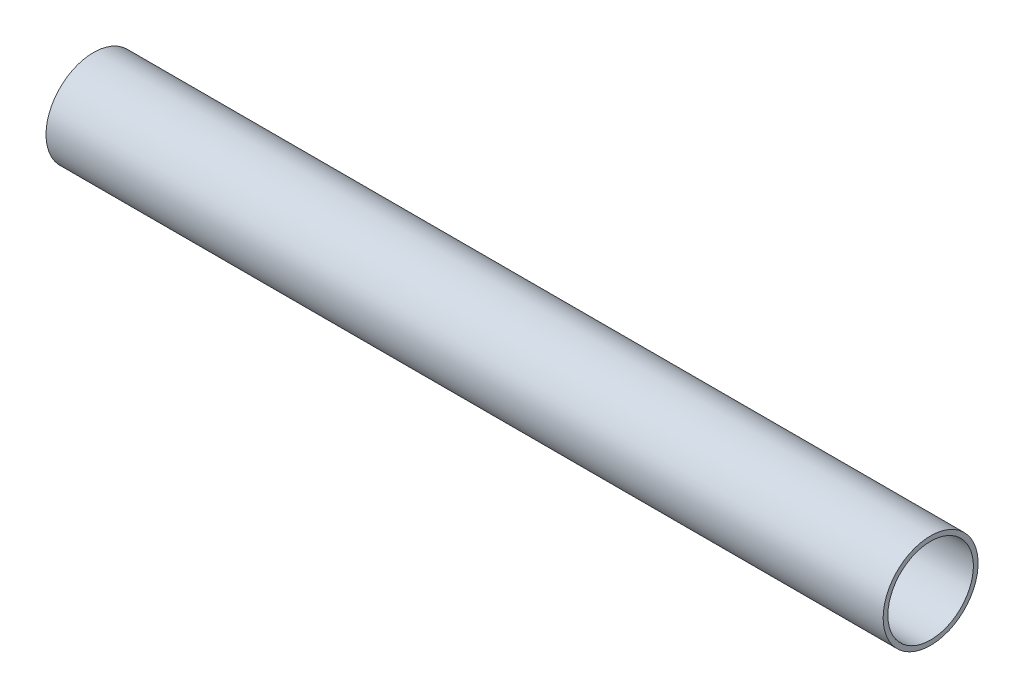
ISO-10303-21;
HEADER;
FILE_DESCRIPTION(('STEP AP214'),'2;1');
FILE_NAME('part.step','',(''),(''),'','','');
FILE_SCHEMA(('AUTOMOTIVE_DESIGN { 1 0 10303 214 1 1 1 1 }'));
ENDSEC;
DATA;
#1=APPLICATION_CONTEXT('core data for automotive mechanical design processes');
#2=APPLICATION_PROTOCOL_DEFINITION('international standard','automotive_design',2000,#1);
#3=PRODUCT_CONTEXT('',#1,'mechanical');
#4=PRODUCT('Part','Part','',(#3));
#5=PRODUCT_RELATED_PRODUCT_CATEGORY('part','',(#4));
#6=PRODUCT_DEFINITION_FORMATION('','',#4);
#7=PRODUCT_DEFINITION_CONTEXT('part definition',#1,'design');
#8=PRODUCT_DEFINITION('design','',#6,#7);
#9=PRODUCT_DEFINITION_SHAPE('','',#8);
#10=(LENGTH_UNIT() NAMED_UNIT(*) SI_UNIT(.MILLI.,.METRE.));
#11=(NAMED_UNIT(*) PLANE_ANGLE_UNIT() SI_UNIT($,.RADIAN.));
#12=(NAMED_UNIT(*) SI_UNIT($,.STERADIAN.) SOLID_ANGLE_UNIT());
#13=UNCERTAINTY_MEASURE_WITH_UNIT(LENGTH_MEASURE(1.E-05),#10,'distance_accuracy_value','');
#14=(GEOMETRIC_REPRESENTATION_CONTEXT(3) GLOBAL_UNCERTAINTY_ASSIGNED_CONTEXT((#13)) GLOBAL_UNIT_ASSIGNED_CONTEXT((#10,
#11,#12)) REPRESENTATION_CONTEXT('',''));
#15=CARTESIAN_POINT('',(0.,0.,0.));
#16=DIRECTION('',(0.,0.,1.));
#17=DIRECTION('',(1.,0.,0.));
#18=AXIS2_PLACEMENT_3D('',#15,#16,#17);
#19=CARTESIAN_POINT('',(139.95575006,0.,0.));
#20=DIRECTION('',(1.,0.,0.));
#21=DIRECTION('',(0.,0.,-1.));
#22=AXIS2_PLACEMENT_3D('',#19,#20,#21);
#23=PLANE('',#22);
#24=CARTESIAN_POINT('',(139.95575006,0.,0.));
#25=DIRECTION('',(1.,0.,0.));
#26=DIRECTION('',(0.,0.,-1.));
#27=AXIS2_PLACEMENT_3D('',#24,#25,#26);
#28=CIRCLE('',#27,15.875);
#29=CARTESIAN_POINT('',(139.95575006,0.,15.875));
#30=VERTEX_POINT('',#29);
#31=EDGE_CURVE('E11',#30,#30,#28,.T.);
#32=ORIENTED_EDGE('',*,*,#31,.T.);
#33=EDGE_LOOP('',(#32));
#34=FACE_BOUND('',#33,.T.);
#35=CARTESIAN_POINT('',(139.95575006,0.,0.));
#36=DIRECTION('',(1.,0.,0.));
#37=DIRECTION('',(0.,0.,-1.));
#38=AXIS2_PLACEMENT_3D('',#35,#36,#37);
#39=CIRCLE('',#38,14.2875);
#40=CARTESIAN_POINT('',(139.95575006,0.,14.2875));
#41=VERTEX_POINT('',#40);
#42=EDGE_CURVE('E58',#41,#41,#39,.T.);
#43=ORIENTED_EDGE('',*,*,#42,.F.);
#44=EDGE_LOOP('',(#43));
#45=FACE_BOUND('',#44,.T.);
#46=ADVANCED_FACE('F47',(#34,#45),#23,.T.);
#47=CARTESIAN_POINT('',(-139.95575006,0.,0.));
#48=DIRECTION('',(1.,0.,0.));
#49=DIRECTION('',(0.,0.,-1.));
#50=AXIS2_PLACEMENT_3D('',#47,#48,#49);
#51=PLANE('',#50);
#52=CARTESIAN_POINT('',(-139.95575006,0.,0.));
#53=DIRECTION('',(1.,0.,0.));
#54=DIRECTION('',(0.,0.,-1.));
#55=AXIS2_PLACEMENT_3D('',#52,#53,#54);
#56=CIRCLE('',#55,15.875);
#57=CARTESIAN_POINT('',(-139.95575006,0.,15.875));
#58=VERTEX_POINT('',#57);
#59=EDGE_CURVE('E51',#58,#58,#56,.T.);
#60=ORIENTED_EDGE('',*,*,#59,.F.);
#61=EDGE_LOOP('',(#60));
#62=FACE_BOUND('',#61,.T.);
#63=CARTESIAN_POINT('',(-139.95575006,0.,0.));
#64=DIRECTION('',(1.,0.,0.));
#65=DIRECTION('',(0.,0.,-1.));
#66=AXIS2_PLACEMENT_3D('',#63,#64,#65);
#67=CIRCLE('',#66,14.2875);
#68=CARTESIAN_POINT('',(-139.95575006,0.,14.2875));
#69=VERTEX_POINT('',#68);
#70=EDGE_CURVE('E60',#69,#69,#67,.T.);
#71=ORIENTED_EDGE('',*,*,#70,.T.);
#72=EDGE_LOOP('',(#71));
#73=FACE_BOUND('',#72,.T.);
#74=ADVANCED_FACE('F70',(#62,#73),#51,.F.);
#75=CARTESIAN_POINT('',(139.95575006,0.,0.));
#76=DIRECTION('',(-1.,0.,0.));
#77=DIRECTION('',(0.,0.,1.));
#78=AXIS2_PLACEMENT_3D('',#75,#76,#77);
#79=CYLINDRICAL_SURFACE('',#78,15.875);
#80=CARTESIAN_POINT('',(139.95575006,0.,15.875));
#81=CARTESIAN_POINT('',(137.040005267083,0.,15.875));
#82=CARTESIAN_POINT('',(134.124260474167,0.,15.875));
#83=CARTESIAN_POINT('',(128.292770888333,0.,15.875));
#84=CARTESIAN_POINT('',(125.377026095417,0.,15.875));
#85=CARTESIAN_POINT('',(119.545536509583,0.,15.875));
#86=CARTESIAN_POINT('',(116.629791716667,0.,15.875));
#87=CARTESIAN_POINT('',(110.798302130833,0.,15.875));
#88=CARTESIAN_POINT('',(107.882557337917,0.,15.875));
#89=CARTESIAN_POINT('',(102.051067752083,0.,15.875));
#90=CARTESIAN_POINT('',(99.1353229591666,0.,15.875));
#91=CARTESIAN_POINT('',(93.3038333733333,0.,15.875));
#92=CARTESIAN_POINT('',(90.3880885804166,0.,15.875));
#93=CARTESIAN_POINT('',(84.5565989945833,0.,15.875));
#94=CARTESIAN_POINT('',(81.6408542016666,0.,15.875));
#95=CARTESIAN_POINT('',(75.8093646158333,0.,15.875));
#96=CARTESIAN_POINT('',(72.8936198229166,0.,15.875));
#97=CARTESIAN_POINT('',(67.0621302370833,0.,15.875));
#98=CARTESIAN_POINT('',(64.1463854441666,0.,15.875));
#99=CARTESIAN_POINT('',(58.3148958583333,0.,15.875));
#100=CARTESIAN_POINT('',(55.3991510654166,0.,15.875));
#101=CARTESIAN_POINT('',(49.5676614795833,0.,15.875));
#102=CARTESIAN_POINT('',(46.6519166866666,0.,15.875));
#103=CARTESIAN_POINT('',(40.8204271008333,0.,15.875));
#104=CARTESIAN_POINT('',(37.9046823079166,0.,15.875));
#105=CARTESIAN_POINT('',(32.0731927220833,0.,15.875));
#106=CARTESIAN_POINT('',(29.1574479291666,0.,15.875));
#107=CARTESIAN_POINT('',(23.3259583433333,0.,15.875));
#108=CARTESIAN_POINT('',(20.4102135504166,0.,15.875));
#109=CARTESIAN_POINT('',(14.5787239645833,0.,15.875));
#110=CARTESIAN_POINT('',(11.6629791716666,0.,15.875));
#111=CARTESIAN_POINT('',(5.83148958583327,0.,15.875));
#112=CARTESIAN_POINT('',(2.91574479291661,0.,15.875));
#113=CARTESIAN_POINT('',(-2.91574479291672,0.,15.875));
#114=CARTESIAN_POINT('',(-5.83148958583339,0.,15.875));
#115=CARTESIAN_POINT('',(-11.6629791716667,0.,15.875));
#116=CARTESIAN_POINT('',(-14.5787239645834,0.,15.875));
#117=CARTESIAN_POINT('',(-20.4102135504167,0.,15.875));
#118=CARTESIAN_POINT('',(-23.3259583433334,0.,15.875));
#119=CARTESIAN_POINT('',(-29.1574479291667,0.,15.875));
#120=CARTESIAN_POINT('',(-32.0731927220834,0.,15.875));
#121=CARTESIAN_POINT('',(-37.9046823079167,0.,15.875));
#122=CARTESIAN_POINT('',(-40.8204271008334,0.,15.875));
#123=CARTESIAN_POINT('',(-46.6519166866667,0.,15.875));
#124=CARTESIAN_POINT('',(-49.5676614795834,0.,15.875));
#125=CARTESIAN_POINT('',(-55.3991510654168,0.,15.875));
#126=CARTESIAN_POINT('',(-58.3148958583334,0.,15.875));
#127=CARTESIAN_POINT('',(-64.1463854441667,0.,15.875));
#128=CARTESIAN_POINT('',(-67.0621302370834,0.,15.875));
#129=CARTESIAN_POINT('',(-72.8936198229167,0.,15.875));
#130=CARTESIAN_POINT('',(-75.8093646158334,0.,15.875));
#131=CARTESIAN_POINT('',(-81.6408542016667,0.,15.875));
#132=CARTESIAN_POINT('',(-84.5565989945834,0.,15.875));
#133=CARTESIAN_POINT('',(-90.3880885804167,0.,15.875));
#134=CARTESIAN_POINT('',(-93.3038333733334,0.,15.875));
#135=CARTESIAN_POINT('',(-99.1353229591668,0.,15.875));
#136=CARTESIAN_POINT('',(-102.051067752083,0.,15.875));
#137=CARTESIAN_POINT('',(-107.882557337917,0.,15.875));
#138=CARTESIAN_POINT('',(-110.798302130833,0.,15.875));
#139=CARTESIAN_POINT('',(-116.629791716667,0.,15.875));
#140=CARTESIAN_POINT('',(-119.545536509583,0.,15.875));
#141=CARTESIAN_POINT('',(-125.377026095417,0.,15.875));
#142=CARTESIAN_POINT('',(-128.292770888333,0.,15.875));
#143=CARTESIAN_POINT('',(-134.124260474167,0.,15.875));
#144=CARTESIAN_POINT('',(-137.040005267083,0.,15.875));
#145=CARTESIAN_POINT('',(-139.95575006,0.,15.875));
#146=B_SPLINE_CURVE_WITH_KNOTS('',3,(#80,#81,#82,#83,#84,#85,#86,#87,#88,#89,#90,#91,#92,#93,
#94,#95,#96,#97,#98,#99,#100,#101,#102,#103,#104,#105,#106,#107,#108,#109,#110,#111,#112,#113,
#114,#115,#116,#117,#118,#119,#120,#121,#122,#123,#124,#125,#126,#127,#128,#129,#130,#131,#132,
#133,#134,#135,#136,#137,#138,#139,#140,#141,#142,#143,#144,#145),.UNSPECIFIED.,.F.,.F.,(4,2,2,
2,2,2,2,2,2,2,2,2,2,2,2,2,2,2,2,2,2,2,2,2,2,2,2,2,2,2,2,2,4),(0.,8.74723437875,17.4944687575,
26.24170313625,34.988937515,43.73617189375,52.4834062725,61.23064065125,69.97787503,
78.72510940875,87.4723437875,96.21957816625,104.966812545,113.71404692375,122.4612813025,
131.20851568125,139.95575006,148.70298443875,157.4502188175,166.19745319625,174.944687575,
183.69192195375,192.4391563325,201.18639071125,209.93362509,218.68085946875,227.4280938475,
236.17532822625,244.922562605,253.66979698375,262.4170313625,271.16426574125,279.91150012),.UNSPECIFIED.);
#147=EDGE_CURVE('BSEAM49',#30,#58,#146,.T.);
#148=ORIENTED_EDGE('',*,*,#31,.F.);
#149=ORIENTED_EDGE('',*,*,#59,.T.);
#150=ORIENTED_EDGE('',*,*,#147,.T.);
#151=ORIENTED_EDGE('',*,*,#147,.F.);
#152=EDGE_LOOP('',(#148,#150,#149,#151));
#153=FACE_BOUND('',#152,.T.);
#154=ADVANCED_FACE('F49',(#153),#79,.T.);
#155=CARTESIAN_POINT('',(139.95575006,0.,0.));
#156=DIRECTION('',(-1.,0.,0.));
#157=DIRECTION('',(0.,0.,1.));
#158=AXIS2_PLACEMENT_3D('',#155,#156,#157);
#159=CYLINDRICAL_SURFACE('',#158,14.2875);
#160=CARTESIAN_POINT('',(139.95575006,0.,14.2875));
#161=CARTESIAN_POINT('',(137.040005267083,0.,14.2875));
#162=CARTESIAN_POINT('',(134.124260474167,0.,14.2875));
#163=CARTESIAN_POINT('',(128.292770888333,0.,14.2875));
#164=CARTESIAN_POINT('',(125.377026095417,0.,14.2875));
#165=CARTESIAN_POINT('',(119.545536509583,0.,14.2875));
#166=CARTESIAN_POINT('',(116.629791716667,0.,14.2875));
#167=CARTESIAN_POINT('',(110.798302130833,0.,14.2875));
#168=CARTESIAN_POINT('',(107.882557337917,0.,14.2875));
#169=CARTESIAN_POINT('',(102.051067752083,0.,14.2875));
#170=CARTESIAN_POINT('',(99.1353229591666,0.,14.2875));
#171=CARTESIAN_POINT('',(93.3038333733333,0.,14.2875));
#172=CARTESIAN_POINT('',(90.3880885804166,0.,14.2875));
#173=CARTESIAN_POINT('',(84.5565989945833,0.,14.2875));
#174=CARTESIAN_POINT('',(81.6408542016666,0.,14.2875));
#175=CARTESIAN_POINT('',(75.8093646158333,0.,14.2875));
#176=CARTESIAN_POINT('',(72.8936198229166,0.,14.2875));
#177=CARTESIAN_POINT('',(67.0621302370833,0.,14.2875));
#178=CARTESIAN_POINT('',(64.1463854441666,0.,14.2875));
#179=CARTESIAN_POINT('',(58.3148958583333,0.,14.2875));
#180=CARTESIAN_POINT('',(55.3991510654166,0.,14.2875));
#181=CARTESIAN_POINT('',(49.5676614795833,0.,14.2875));
#182=CARTESIAN_POINT('',(46.6519166866666,0.,14.2875));
#183=CARTESIAN_POINT('',(40.8204271008333,0.,14.2875));
#184=CARTESIAN_POINT('',(37.9046823079166,0.,14.2875));
#185=CARTESIAN_POINT('',(32.0731927220833,0.,14.2875));
#186=CARTESIAN_POINT('',(29.1574479291666,0.,14.2875));
#187=CARTESIAN_POINT('',(23.3259583433333,0.,14.2875));
#188=CARTESIAN_POINT('',(20.4102135504166,0.,14.2875));
#189=CARTESIAN_POINT('',(14.5787239645833,0.,14.2875));
#190=CARTESIAN_POINT('',(11.6629791716666,0.,14.2875));
#191=CARTESIAN_POINT('',(5.8314895858333,0.,14.2875));
#192=CARTESIAN_POINT('',(2.91574479291664,0.,14.2875));
#193=CARTESIAN_POINT('',(-2.91574479291669,0.,14.2875));
#194=CARTESIAN_POINT('',(-5.83148958583336,0.,14.2875));
#195=CARTESIAN_POINT('',(-11.6629791716667,0.,14.2875));
#196=CARTESIAN_POINT('',(-14.5787239645834,0.,14.2875));
#197=CARTESIAN_POINT('',(-20.4102135504167,0.,14.2875));
#198=CARTESIAN_POINT('',(-23.3259583433334,0.,14.2875));
#199=CARTESIAN_POINT('',(-29.1574479291667,0.,14.2875));
#200=CARTESIAN_POINT('',(-32.0731927220834,0.,14.2875));
#201=CARTESIAN_POINT('',(-37.9046823079167,0.,14.2875));
#202=CARTESIAN_POINT('',(-40.8204271008334,0.,14.2875));
#203=CARTESIAN_POINT('',(-46.6519166866667,0.,14.2875));
#204=CARTESIAN_POINT('',(-49.5676614795834,0.,14.2875));
#205=CARTESIAN_POINT('',(-55.3991510654167,0.,14.2875));
#206=CARTESIAN_POINT('',(-58.3148958583334,0.,14.2875));
#207=CARTESIAN_POINT('',(-64.1463854441667,0.,14.2875));
#208=CARTESIAN_POINT('',(-67.0621302370834,0.,14.2875));
#209=CARTESIAN_POINT('',(-72.8936198229167,0.,14.2875));
#210=CARTESIAN_POINT('',(-75.8093646158334,0.,14.2875));
#211=CARTESIAN_POINT('',(-81.6408542016667,0.,14.2875));
#212=CARTESIAN_POINT('',(-84.5565989945834,0.,14.2875));
#213=CARTESIAN_POINT('',(-90.3880885804167,0.,14.2875));
#214=CARTESIAN_POINT('',(-93.3038333733334,0.,14.2875));
#215=CARTESIAN_POINT('',(-99.1353229591667,0.,14.2875));
#216=CARTESIAN_POINT('',(-102.051067752083,0.,14.2875));
#217=CARTESIAN_POINT('',(-107.882557337917,0.,14.2875));
#218=CARTESIAN_POINT('',(-110.798302130833,0.,14.2875));
#219=CARTESIAN_POINT('',(-116.629791716667,0.,14.2875));
#220=CARTESIAN_POINT('',(-119.545536509583,0.,14.2875));
#221=CARTESIAN_POINT('',(-125.377026095417,0.,14.2875));
#222=CARTESIAN_POINT('',(-128.292770888333,0.,14.2875));
#223=CARTESIAN_POINT('',(-134.124260474167,0.,14.2875));
#224=CARTESIAN_POINT('',(-137.040005267083,0.,14.2875));
#225=CARTESIAN_POINT('',(-139.95575006,0.,14.2875));
#226=B_SPLINE_CURVE_WITH_KNOTS('',3,(#160,#161,#162,#163,#164,#165,#166,#167,#168,#169,#170,
#171,#172,#173,#174,#175,#176,#177,#178,#179,#180,#181,#182,#183,#184,#185,#186,#187,#188,#189,
#190,#191,#192,#193,#194,#195,#196,#197,#198,#199,#200,#201,#202,#203,#204,#205,#206,#207,#208,
#209,#210,#211,#212,#213,#214,#215,#216,#217,#218,#219,#220,#221,#222,#223,#224,#225),
.UNSPECIFIED.,.F.,.F.,(4,2,2,2,2,2,2,2,2,2,2,2,2,2,2,2,2,2,2,2,2,2,2,2,2,2,2,2,2,2,2,2,4),(0.,
8.74723437875002,17.4944687575,26.24170313625,34.988937515,43.73617189375,52.4834062725,
61.23064065125,69.97787503,78.72510940875,87.4723437875,96.21957816625,104.966812545,
113.71404692375,122.4612813025,131.20851568125,139.95575006,148.70298443875,157.4502188175,
166.19745319625,174.944687575,183.69192195375,192.4391563325,201.18639071125,209.93362509,
218.68085946875,227.4280938475,236.17532822625,244.922562605,253.66979698375,262.4170313625,
271.16426574125,279.91150012),.UNSPECIFIED.);
#227=EDGE_CURVE('BSEAM66',#41,#69,#226,.T.);
#228=ORIENTED_EDGE('',*,*,#42,.T.);
#229=ORIENTED_EDGE('',*,*,#70,.F.);
#230=ORIENTED_EDGE('',*,*,#227,.T.);
#231=ORIENTED_EDGE('',*,*,#227,.F.);
#232=EDGE_LOOP('',(#228,#230,#229,#231));
#233=FACE_BOUND('',#232,.T.);
#234=ADVANCED_FACE('F66',(#233),#159,.F.);
#235=CLOSED_SHELL('',(#46,#74,#154,#234));
#236=MANIFOLD_SOLID_BREP('B2',#235);
#237=ADVANCED_BREP_SHAPE_REPRESENTATION('',(#18,#236),#14);
#238=SHAPE_DEFINITION_REPRESENTATION(#9,#237);
ENDSEC;
END-ISO-10303-21;
